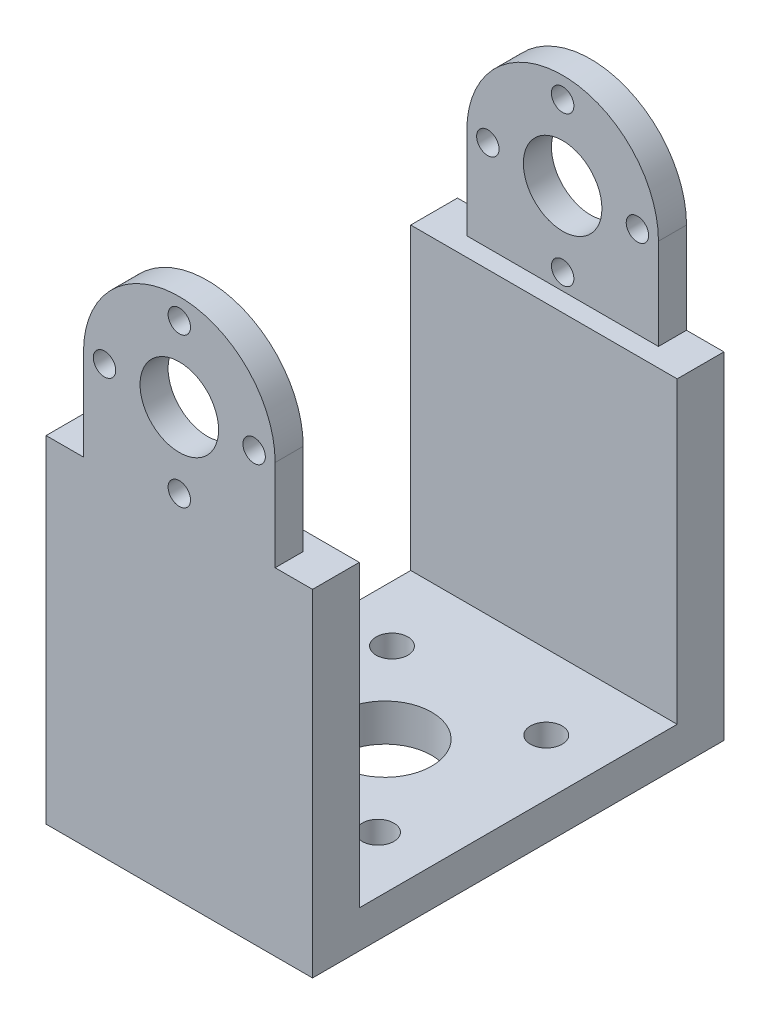
ISO-10303-21;
HEADER;
FILE_DESCRIPTION(('STEP AP214'),'2;1');
FILE_NAME('part.step','',(''),(''),'','','');
FILE_SCHEMA(('AUTOMOTIVE_DESIGN { 1 0 10303 214 1 1 1 1 }'));
ENDSEC;
DATA;
#1=APPLICATION_CONTEXT('core data for automotive mechanical design processes');
#2=APPLICATION_PROTOCOL_DEFINITION('international standard','automotive_design',2000,#1);
#3=PRODUCT_CONTEXT('',#1,'mechanical');
#4=PRODUCT('Part','Part','',(#3));
#5=PRODUCT_RELATED_PRODUCT_CATEGORY('part','',(#4));
#6=PRODUCT_DEFINITION_FORMATION('','',#4);
#7=PRODUCT_DEFINITION_CONTEXT('part definition',#1,'design');
#8=PRODUCT_DEFINITION('design','',#6,#7);
#9=PRODUCT_DEFINITION_SHAPE('','',#8);
#10=(LENGTH_UNIT() NAMED_UNIT(*) SI_UNIT(.MILLI.,.METRE.));
#11=(NAMED_UNIT(*) PLANE_ANGLE_UNIT() SI_UNIT($,.RADIAN.));
#12=(NAMED_UNIT(*) SI_UNIT($,.STERADIAN.) SOLID_ANGLE_UNIT());
#13=UNCERTAINTY_MEASURE_WITH_UNIT(LENGTH_MEASURE(1.E-05),#10,'distance_accuracy_value','');
#14=(GEOMETRIC_REPRESENTATION_CONTEXT(3) GLOBAL_UNCERTAINTY_ASSIGNED_CONTEXT((#13)) GLOBAL_UNIT_ASSIGNED_CONTEXT((#10,
#11,#12)) REPRESENTATION_CONTEXT('',''));
#15=CARTESIAN_POINT('',(0.,0.,0.));
#16=DIRECTION('',(0.,0.,1.));
#17=DIRECTION('',(1.,0.,0.));
#18=AXIS2_PLACEMENT_3D('',#15,#16,#17);
#19=CARTESIAN_POINT('',(17.25,-9.75,-17.));
#20=DIRECTION('',(0.,0.,-1.));
#21=DIRECTION('',(-1.,0.,0.));
#22=AXIS2_PLACEMENT_3D('',#19,#20,#21);
#23=PLANE('',#22);
#24=DIRECTION('',(1.,0.,0.));
#25=VECTOR('',#24,1.);
#26=CARTESIAN_POINT('',(0.,-41.75,-17.));
#27=LINE('',#26,#25);
#28=CARTESIAN_POINT('',(-14.25,-41.75,-17.));
#29=VERTEX_POINT('',#28);
#30=CARTESIAN_POINT('',(14.25,-41.75,-17.));
#31=VERTEX_POINT('',#30);
#32=EDGE_CURVE('E273',#29,#31,#27,.T.);
#33=ORIENTED_EDGE('',*,*,#32,.T.);
#34=DIRECTION('',(0.,1.,0.));
#35=VECTOR('',#34,1.);
#36=CARTESIAN_POINT('',(14.25,-9.75,-17.));
#37=LINE('',#36,#35);
#38=CARTESIAN_POINT('',(14.25,-9.75,-17.));
#39=VERTEX_POINT('',#38);
#40=EDGE_CURVE('E389',#31,#39,#37,.T.);
#41=ORIENTED_EDGE('',*,*,#40,.T.);
#42=DIRECTION('',(-1.,0.,0.));
#43=VECTOR('',#42,1.);
#44=CARTESIAN_POINT('',(17.25,-9.75,-17.));
#45=LINE('',#44,#43);
#46=CARTESIAN_POINT('',(-14.25,-9.75,-17.));
#47=VERTEX_POINT('',#46);
#48=EDGE_CURVE('E11',#39,#47,#45,.T.);
#49=ORIENTED_EDGE('',*,*,#48,.T.);
#50=DIRECTION('',(0.,-1.,0.));
#51=VECTOR('',#50,1.);
#52=CARTESIAN_POINT('',(-14.25,-9.74999999999999,-17.));
#53=LINE('',#52,#51);
#54=EDGE_CURVE('E385',#47,#29,#53,.T.);
#55=ORIENTED_EDGE('',*,*,#54,.T.);
#56=EDGE_LOOP('',(#33,#41,#49,#55));
#57=FACE_BOUND('',#56,.T.);
#58=ADVANCED_FACE('F47',(#57),#23,.F.);
#59=CARTESIAN_POINT('',(10.25,-9.75,-19.));
#60=DIRECTION('',(0.,-1.,0.));
#61=DIRECTION('',(0.,0.,-1.));
#62=AXIS2_PLACEMENT_3D('',#59,#60,#61);
#63=PLANE('',#62);
#64=ORIENTED_EDGE('',*,*,#48,.F.);
#65=DIRECTION('',(0.,0.,-1.));
#66=VECTOR('',#65,1.);
#67=CARTESIAN_POINT('',(14.25,-9.75,22.));
#68=LINE('',#67,#66);
#69=CARTESIAN_POINT('',(14.25,-9.75,-22.));
#70=VERTEX_POINT('',#69);
#71=EDGE_CURVE('E179',#39,#70,#68,.T.);
#72=ORIENTED_EDGE('',*,*,#71,.T.);
#73=DIRECTION('',(-1.,0.,0.));
#74=VECTOR('',#73,1.);
#75=CARTESIAN_POINT('',(10.25,-9.75,-22.));
#76=LINE('',#75,#74);
#77=CARTESIAN_POINT('',(10.25,-9.75,-22.));
#78=VERTEX_POINT('',#77);
#79=EDGE_CURVE('E276',#70,#78,#76,.T.);
#80=ORIENTED_EDGE('',*,*,#79,.T.);
#81=DIRECTION('',(0.,0.,1.));
#82=VECTOR('',#81,1.);
#83=CARTESIAN_POINT('',(10.25,-9.75,-22.));
#84=LINE('',#83,#82);
#85=CARTESIAN_POINT('',(10.25,-9.75,-19.));
#86=VERTEX_POINT('',#85);
#87=EDGE_CURVE('E51',#78,#86,#84,.T.);
#88=ORIENTED_EDGE('',*,*,#87,.T.);
#89=DIRECTION('',(-1.,0.,0.));
#90=VECTOR('',#89,1.);
#91=CARTESIAN_POINT('',(10.25,-9.75,-19.));
#92=LINE('',#91,#90);
#93=CARTESIAN_POINT('',(-10.25,-9.75,-19.));
#94=VERTEX_POINT('',#93);
#95=EDGE_CURVE('E336',#86,#94,#92,.T.);
#96=ORIENTED_EDGE('',*,*,#95,.T.);
#97=DIRECTION('',(0.,0.,-1.));
#98=VECTOR('',#97,1.);
#99=CARTESIAN_POINT('',(-10.25,-9.75,-22.));
#100=LINE('',#99,#98);
#101=CARTESIAN_POINT('',(-10.25,-9.75,-22.));
#102=VERTEX_POINT('',#101);
#103=EDGE_CURVE('E339',#94,#102,#100,.T.);
#104=ORIENTED_EDGE('',*,*,#103,.T.);
#105=DIRECTION('',(-1.,0.,0.));
#106=VECTOR('',#105,1.);
#107=CARTESIAN_POINT('',(-10.25,-9.75,-22.));
#108=LINE('',#107,#106);
#109=CARTESIAN_POINT('',(-14.25,-9.75,-22.));
#110=VERTEX_POINT('',#109);
#111=EDGE_CURVE('E307',#102,#110,#108,.T.);
#112=ORIENTED_EDGE('',*,*,#111,.T.);
#113=DIRECTION('',(0.,0.,-1.));
#114=VECTOR('',#113,1.);
#115=CARTESIAN_POINT('',(-14.25,-9.75,22.));
#116=LINE('',#115,#114);
#117=EDGE_CURVE('E64',#47,#110,#116,.T.);
#118=ORIENTED_EDGE('',*,*,#117,.F.);
#119=EDGE_LOOP('',(#64,#72,#80,#88,#96,#104,#112,#118));
#120=FACE_BOUND('',#119,.T.);
#121=ADVANCED_FACE('F354',(#120),#63,.F.);
#122=CARTESIAN_POINT('',(0.,-45.75,0.));
#123=DIRECTION('',(0.,-1.,0.));
#124=DIRECTION('',(0.,0.,-1.));
#125=AXIS2_PLACEMENT_3D('',#122,#123,#124);
#126=PLANE('',#125);
#127=DIRECTION('',(0.,0.,-1.));
#128=VECTOR('',#127,1.);
#129=CARTESIAN_POINT('',(14.25,-45.75,0.));
#130=LINE('',#129,#128);
#131=CARTESIAN_POINT('',(14.25,-45.75,22.));
#132=VERTEX_POINT('',#131);
#133=CARTESIAN_POINT('',(14.25,-45.75,-22.));
#134=VERTEX_POINT('',#133);
#135=EDGE_CURVE('E72',#132,#134,#130,.T.);
#136=ORIENTED_EDGE('',*,*,#135,.F.);
#137=DIRECTION('',(1.,0.,0.));
#138=VECTOR('',#137,1.);
#139=CARTESIAN_POINT('',(-10.25,-45.75,22.));
#140=LINE('',#139,#138);
#141=CARTESIAN_POINT('',(-14.25,-45.75,22.));
#142=VERTEX_POINT('',#141);
#143=EDGE_CURVE('E165',#142,#132,#140,.T.);
#144=ORIENTED_EDGE('',*,*,#143,.F.);
#145=DIRECTION('',(0.,0.,-1.));
#146=VECTOR('',#145,1.);
#147=CARTESIAN_POINT('',(-14.25,-45.75,0.));
#148=LINE('',#147,#146);
#149=CARTESIAN_POINT('',(-14.25,-45.75,-22.));
#150=VERTEX_POINT('',#149);
#151=EDGE_CURVE('E168',#142,#150,#148,.T.);
#152=ORIENTED_EDGE('',*,*,#151,.T.);
#153=DIRECTION('',(-1.,0.,0.));
#154=VECTOR('',#153,1.);
#155=CARTESIAN_POINT('',(10.25,-45.75,-22.));
#156=LINE('',#155,#154);
#157=EDGE_CURVE('E167',#134,#150,#156,.T.);
#158=ORIENTED_EDGE('',*,*,#157,.F.);
#159=EDGE_LOOP('',(#136,#144,#152,#158));
#160=FACE_BOUND('',#159,.T.);
#161=CARTESIAN_POINT('',(-8.24999999999981,-45.75,-8.99999999999999));
#162=DIRECTION('',(0.,-1.,0.));
#163=DIRECTION('',(0.,0.,-1.));
#164=AXIS2_PLACEMENT_3D('',#161,#162,#163);
#165=CIRCLE('',#164,1.7);
#166=CARTESIAN_POINT('',(-8.24999999999981,-45.75,-10.7));
#167=VERTEX_POINT('',#166);
#168=EDGE_CURVE('E245',#167,#167,#165,.T.);
#169=ORIENTED_EDGE('',*,*,#168,.F.);
#170=EDGE_LOOP('',(#169));
#171=FACE_BOUND('',#170,.T.);
#172=CARTESIAN_POINT('',(8.2500000000002,-45.75,-8.99999999999999));
#173=DIRECTION('',(0.,-1.,0.));
#174=DIRECTION('',(0.,0.,-1.));
#175=AXIS2_PLACEMENT_3D('',#172,#173,#174);
#176=CIRCLE('',#175,1.7);
#177=CARTESIAN_POINT('',(8.2500000000002,-45.75,-10.7));
#178=VERTEX_POINT('',#177);
#179=EDGE_CURVE('E279',#178,#178,#176,.T.);
#180=ORIENTED_EDGE('',*,*,#179,.F.);
#181=EDGE_LOOP('',(#180));
#182=FACE_BOUND('',#181,.T.);
#183=CARTESIAN_POINT('',(8.25000000000001,-45.75,9.00000000000001));
#184=DIRECTION('',(0.,-1.,0.));
#185=DIRECTION('',(0.,0.,-1.));
#186=AXIS2_PLACEMENT_3D('',#183,#184,#185);
#187=CIRCLE('',#186,1.7);
#188=CARTESIAN_POINT('',(8.25000000000001,-45.75,7.30000000000001));
#189=VERTEX_POINT('',#188);
#190=EDGE_CURVE('E282',#189,#189,#187,.T.);
#191=ORIENTED_EDGE('',*,*,#190,.F.);
#192=EDGE_LOOP('',(#191));
#193=FACE_BOUND('',#192,.T.);
#194=CARTESIAN_POINT('',(-8.24999999999999,-45.75,9.00000000000001));
#195=DIRECTION('',(0.,-1.,0.));
#196=DIRECTION('',(0.,0.,-1.));
#197=AXIS2_PLACEMENT_3D('',#194,#195,#196);
#198=CIRCLE('',#197,1.7);
#199=CARTESIAN_POINT('',(-8.24999999999999,-45.75,7.30000000000001));
#200=VERTEX_POINT('',#199);
#201=EDGE_CURVE('E285',#200,#200,#198,.T.);
#202=ORIENTED_EDGE('',*,*,#201,.F.);
#203=EDGE_LOOP('',(#202));
#204=FACE_BOUND('',#203,.T.);
#205=CARTESIAN_POINT('',(0.,-45.75,0.));
#206=DIRECTION('',(0.,-1.,0.));
#207=DIRECTION('',(0.,0.,-1.));
#208=AXIS2_PLACEMENT_3D('',#205,#206,#207);
#209=CIRCLE('',#208,5.);
#210=CARTESIAN_POINT('',(0.,-45.75,-5.));
#211=VERTEX_POINT('',#210);
#212=EDGE_CURVE('E169',#211,#211,#209,.T.);
#213=ORIENTED_EDGE('',*,*,#212,.F.);
#214=EDGE_LOOP('',(#213));
#215=FACE_BOUND('',#214,.T.);
#216=ADVANCED_FACE('F49',(#160,#171,#182,#193,#204,#215),#126,.T.);
#217=CARTESIAN_POINT('',(-10.25,0.,-22.));
#218=DIRECTION('',(-1.,0.,0.));
#219=DIRECTION('',(0.,0.,1.));
#220=AXIS2_PLACEMENT_3D('',#217,#218,#219);
#221=PLANE('',#220);
#222=DIRECTION('',(0.,-1.,0.));
#223=VECTOR('',#222,1.);
#224=CARTESIAN_POINT('',(-10.25,0.,-22.));
#225=LINE('',#224,#223);
#226=CARTESIAN_POINT('',(-10.25,0.,-22.));
#227=VERTEX_POINT('',#226);
#228=EDGE_CURVE('E303',#227,#102,#225,.T.);
#229=ORIENTED_EDGE('',*,*,#228,.T.);
#230=ORIENTED_EDGE('',*,*,#103,.F.);
#231=DIRECTION('',(0.,-1.,0.));
#232=VECTOR('',#231,1.);
#233=CARTESIAN_POINT('',(-10.25,10.25,-19.));
#234=LINE('',#233,#232);
#235=CARTESIAN_POINT('',(-10.25,0.,-19.));
#236=VERTEX_POINT('',#235);
#237=EDGE_CURVE('E56',#236,#94,#234,.T.);
#238=ORIENTED_EDGE('',*,*,#237,.F.);
#239=DIRECTION('',(0.,0.,1.));
#240=VECTOR('',#239,1.);
#241=CARTESIAN_POINT('',(-10.25,0.,-22.));
#242=LINE('',#241,#240);
#243=EDGE_CURVE('E310',#227,#236,#242,.T.);
#244=ORIENTED_EDGE('',*,*,#243,.F.);
#245=EDGE_LOOP('',(#229,#230,#238,#244));
#246=FACE_BOUND('',#245,.T.);
#247=ADVANCED_FACE('F365',(#246),#221,.T.);
#248=CARTESIAN_POINT('',(0.,0.,-22.));
#249=DIRECTION('',(0.,0.,1.));
#250=DIRECTION('',(1.,0.,0.));
#251=AXIS2_PLACEMENT_3D('',#248,#249,#250);
#252=CYLINDRICAL_SURFACE('',#251,10.25);
#253=CARTESIAN_POINT('',(0.,0.,-19.));
#254=DIRECTION('',(0.,0.,-1.));
#255=DIRECTION('',(-1.,0.,0.));
#256=AXIS2_PLACEMENT_3D('',#253,#254,#255);
#257=CIRCLE('',#256,10.25);
#258=CARTESIAN_POINT('',(10.25,0.,-19.));
#259=VERTEX_POINT('',#258);
#260=EDGE_CURVE('E299',#259,#236,#257,.F.);
#261=ORIENTED_EDGE('',*,*,#260,.F.);
#262=DIRECTION('',(0.,0.,1.));
#263=VECTOR('',#262,1.);
#264=CARTESIAN_POINT('',(10.25,0.,-22.));
#265=LINE('',#264,#263);
#266=CARTESIAN_POINT('',(10.25,0.,-22.));
#267=VERTEX_POINT('',#266);
#268=EDGE_CURVE('E323',#267,#259,#265,.T.);
#269=ORIENTED_EDGE('',*,*,#268,.F.);
#270=CARTESIAN_POINT('',(0.,0.,-22.));
#271=DIRECTION('',(0.,0.,1.));
#272=DIRECTION('',(1.,0.,0.));
#273=AXIS2_PLACEMENT_3D('',#270,#271,#272);
#274=CIRCLE('',#273,10.25);
#275=EDGE_CURVE('E306',#267,#227,#274,.T.);
#276=ORIENTED_EDGE('',*,*,#275,.T.);
#277=ORIENTED_EDGE('',*,*,#243,.T.);
#278=EDGE_LOOP('',(#261,#269,#276,#277));
#279=FACE_BOUND('',#278,.T.);
#280=ADVANCED_FACE('F368',(#279),#252,.T.);
#281=CARTESIAN_POINT('',(0.,0.,-22.));
#282=DIRECTION('',(0.,0.,1.));
#283=DIRECTION('',(1.,0.,0.));
#284=AXIS2_PLACEMENT_3D('',#281,#282,#283);
#285=CYLINDRICAL_SURFACE('',#284,4.2);
#286=CARTESIAN_POINT('',(0.,0.,-19.));
#287=DIRECTION('',(0.,0.,-1.));
#288=DIRECTION('',(-1.,0.,0.));
#289=AXIS2_PLACEMENT_3D('',#286,#287,#288);
#290=CIRCLE('',#289,4.2);
#291=CARTESIAN_POINT('',(-4.2,0.,-19.));
#292=VERTEX_POINT('',#291);
#293=EDGE_CURVE('E325',#292,#292,#290,.F.);
#294=ORIENTED_EDGE('',*,*,#293,.T.);
#295=EDGE_LOOP('',(#294));
#296=FACE_BOUND('',#295,.T.);
#297=CARTESIAN_POINT('',(0.,0.,-22.));
#298=DIRECTION('',(0.,0.,1.));
#299=DIRECTION('',(1.,0.,0.));
#300=AXIS2_PLACEMENT_3D('',#297,#298,#299);
#301=CIRCLE('',#300,4.2);
#302=CARTESIAN_POINT('',(4.2,0.,-22.));
#303=VERTEX_POINT('',#302);
#304=EDGE_CURVE('E311',#303,#303,#301,.T.);
#305=ORIENTED_EDGE('',*,*,#304,.F.);
#306=EDGE_LOOP('',(#305));
#307=FACE_BOUND('',#306,.T.);
#308=ADVANCED_FACE('F440',(#296,#307),#285,.F.);
#309=CARTESIAN_POINT('',(8.,0.,-22.));
#310=DIRECTION('',(0.,0.,1.));
#311=DIRECTION('',(1.,0.,0.));
#312=AXIS2_PLACEMENT_3D('',#309,#310,#311);
#313=CYLINDRICAL_SURFACE('',#312,1.2);
#314=CARTESIAN_POINT('',(8.,0.,-19.));
#315=DIRECTION('',(0.,0.,-1.));
#316=DIRECTION('',(-1.,0.,0.));
#317=AXIS2_PLACEMENT_3D('',#314,#315,#316);
#318=CIRCLE('',#317,1.2);
#319=CARTESIAN_POINT('',(6.8,0.,-19.));
#320=VERTEX_POINT('',#319);
#321=EDGE_CURVE('E328',#320,#320,#318,.F.);
#322=ORIENTED_EDGE('',*,*,#321,.T.);
#323=EDGE_LOOP('',(#322));
#324=FACE_BOUND('',#323,.T.);
#325=CARTESIAN_POINT('',(8.,0.,-22.));
#326=DIRECTION('',(0.,0.,1.));
#327=DIRECTION('',(1.,0.,0.));
#328=AXIS2_PLACEMENT_3D('',#325,#326,#327);
#329=CIRCLE('',#328,1.2);
#330=CARTESIAN_POINT('',(9.2,0.,-22.));
#331=VERTEX_POINT('',#330);
#332=EDGE_CURVE('E314',#331,#331,#329,.T.);
#333=ORIENTED_EDGE('',*,*,#332,.F.);
#334=EDGE_LOOP('',(#333));
#335=FACE_BOUND('',#334,.T.);
#336=ADVANCED_FACE('F443',(#324,#335),#313,.F.);
#337=CARTESIAN_POINT('',(0.,8.,-22.));
#338=DIRECTION('',(0.,0.,1.));
#339=DIRECTION('',(1.,0.,0.));
#340=AXIS2_PLACEMENT_3D('',#337,#338,#339);
#341=CYLINDRICAL_SURFACE('',#340,1.2);
#342=CARTESIAN_POINT('',(0.,8.,-19.));
#343=DIRECTION('',(0.,0.,-1.));
#344=DIRECTION('',(-1.,0.,0.));
#345=AXIS2_PLACEMENT_3D('',#342,#343,#344);
#346=CIRCLE('',#345,1.2);
#347=CARTESIAN_POINT('',(-1.2,8.,-19.));
#348=VERTEX_POINT('',#347);
#349=EDGE_CURVE('E331',#348,#348,#346,.F.);
#350=ORIENTED_EDGE('',*,*,#349,.T.);
#351=EDGE_LOOP('',(#350));
#352=FACE_BOUND('',#351,.T.);
#353=CARTESIAN_POINT('',(0.,8.,-22.));
#354=DIRECTION('',(0.,0.,1.));
#355=DIRECTION('',(1.,0.,0.));
#356=AXIS2_PLACEMENT_3D('',#353,#354,#355);
#357=CIRCLE('',#356,1.2);
#358=CARTESIAN_POINT('',(1.2,8.,-22.));
#359=VERTEX_POINT('',#358);
#360=EDGE_CURVE('E317',#359,#359,#357,.T.);
#361=ORIENTED_EDGE('',*,*,#360,.F.);
#362=EDGE_LOOP('',(#361));
#363=FACE_BOUND('',#362,.T.);
#364=ADVANCED_FACE('F447',(#352,#363),#341,.F.);
#365=CARTESIAN_POINT('',(-8.,0.,-22.));
#366=DIRECTION('',(0.,0.,1.));
#367=DIRECTION('',(1.,0.,0.));
#368=AXIS2_PLACEMENT_3D('',#365,#366,#367);
#369=CYLINDRICAL_SURFACE('',#368,1.2);
#370=CARTESIAN_POINT('',(-8.,0.,-19.));
#371=DIRECTION('',(0.,0.,-1.));
#372=DIRECTION('',(-1.,0.,0.));
#373=AXIS2_PLACEMENT_3D('',#370,#371,#372);
#374=CIRCLE('',#373,1.2);
#375=CARTESIAN_POINT('',(-9.2,0.,-19.));
#376=VERTEX_POINT('',#375);
#377=EDGE_CURVE('E295',#376,#376,#374,.F.);
#378=ORIENTED_EDGE('',*,*,#377,.T.);
#379=EDGE_LOOP('',(#378));
#380=FACE_BOUND('',#379,.T.);
#381=CARTESIAN_POINT('',(-8.,0.,-22.));
#382=DIRECTION('',(0.,0.,1.));
#383=DIRECTION('',(1.,0.,0.));
#384=AXIS2_PLACEMENT_3D('',#381,#382,#383);
#385=CIRCLE('',#384,1.2);
#386=CARTESIAN_POINT('',(-6.8,0.,-22.));
#387=VERTEX_POINT('',#386);
#388=EDGE_CURVE('E320',#387,#387,#385,.T.);
#389=ORIENTED_EDGE('',*,*,#388,.F.);
#390=EDGE_LOOP('',(#389));
#391=FACE_BOUND('',#390,.T.);
#392=ADVANCED_FACE('F438',(#380,#391),#369,.F.);
#393=CARTESIAN_POINT('',(0.,-8.,-22.));
#394=DIRECTION('',(0.,0.,1.));
#395=DIRECTION('',(1.,0.,0.));
#396=AXIS2_PLACEMENT_3D('',#393,#394,#395);
#397=CYLINDRICAL_SURFACE('',#396,1.2);
#398=CARTESIAN_POINT('',(0.,-8.,-19.));
#399=DIRECTION('',(0.,0.,-1.));
#400=DIRECTION('',(-1.,0.,0.));
#401=AXIS2_PLACEMENT_3D('',#398,#399,#400);
#402=CIRCLE('',#401,1.2);
#403=CARTESIAN_POINT('',(-1.20000000000006,-8.,-19.));
#404=VERTEX_POINT('',#403);
#405=EDGE_CURVE('E291',#404,#404,#402,.F.);
#406=ORIENTED_EDGE('',*,*,#405,.T.);
#407=EDGE_LOOP('',(#406));
#408=FACE_BOUND('',#407,.T.);
#409=CARTESIAN_POINT('',(0.,-8.,-22.));
#410=DIRECTION('',(0.,0.,1.));
#411=DIRECTION('',(1.,0.,0.));
#412=AXIS2_PLACEMENT_3D('',#409,#410,#411);
#413=CIRCLE('',#412,1.2);
#414=CARTESIAN_POINT('',(1.19999999999994,-8.,-22.));
#415=VERTEX_POINT('',#414);
#416=EDGE_CURVE('E296',#415,#415,#413,.T.);
#417=ORIENTED_EDGE('',*,*,#416,.F.);
#418=EDGE_LOOP('',(#417));
#419=FACE_BOUND('',#418,.T.);
#420=ADVANCED_FACE('F435',(#408,#419),#397,.F.);
#421=CARTESIAN_POINT('',(10.25,0.,-22.));
#422=DIRECTION('',(-1.,0.,0.));
#423=DIRECTION('',(0.,0.,1.));
#424=AXIS2_PLACEMENT_3D('',#421,#422,#423);
#425=PLANE('',#424);
#426=DIRECTION('',(0.,-1.,0.));
#427=VECTOR('',#426,1.);
#428=CARTESIAN_POINT('',(10.25,10.25,-19.));
#429=LINE('',#428,#427);
#430=EDGE_CURVE('E294',#259,#86,#429,.T.);
#431=ORIENTED_EDGE('',*,*,#430,.T.);
#432=ORIENTED_EDGE('',*,*,#87,.F.);
#433=DIRECTION('',(0.,-1.,0.));
#434=VECTOR('',#433,1.);
#435=CARTESIAN_POINT('',(10.25,0.,-22.));
#436=LINE('',#435,#434);
#437=EDGE_CURVE('E300',#267,#78,#436,.T.);
#438=ORIENTED_EDGE('',*,*,#437,.F.);
#439=ORIENTED_EDGE('',*,*,#268,.T.);
#440=EDGE_LOOP('',(#431,#432,#438,#439));
#441=FACE_BOUND('',#440,.T.);
#442=ADVANCED_FACE('F372',(#441),#425,.F.);
#443=CARTESIAN_POINT('',(0.,0.,-22.));
#444=DIRECTION('',(0.,0.,1.));
#445=DIRECTION('',(1.,0.,0.));
#446=AXIS2_PLACEMENT_3D('',#443,#444,#445);
#447=PLANE('',#446);
#448=ORIENTED_EDGE('',*,*,#388,.T.);
#449=EDGE_LOOP('',(#448));
#450=FACE_BOUND('',#449,.T.);
#451=ORIENTED_EDGE('',*,*,#360,.T.);
#452=EDGE_LOOP('',(#451));
#453=FACE_BOUND('',#452,.T.);
#454=ORIENTED_EDGE('',*,*,#332,.T.);
#455=EDGE_LOOP('',(#454));
#456=FACE_BOUND('',#455,.T.);
#457=ORIENTED_EDGE('',*,*,#304,.T.);
#458=EDGE_LOOP('',(#457));
#459=FACE_BOUND('',#458,.T.);
#460=ORIENTED_EDGE('',*,*,#79,.F.);
#461=DIRECTION('',(0.,1.,0.));
#462=VECTOR('',#461,1.);
#463=CARTESIAN_POINT('',(14.25,-9.75,-22.));
#464=LINE('',#463,#462);
#465=EDGE_CURVE('E180',#134,#70,#464,.T.);
#466=ORIENTED_EDGE('',*,*,#465,.F.);
#467=ORIENTED_EDGE('',*,*,#157,.T.);
#468=DIRECTION('',(0.,-1.,0.));
#469=VECTOR('',#468,1.);
#470=CARTESIAN_POINT('',(-14.25,-9.75,-22.));
#471=LINE('',#470,#469);
#472=EDGE_CURVE('E364',#110,#150,#471,.T.);
#473=ORIENTED_EDGE('',*,*,#472,.F.);
#474=ORIENTED_EDGE('',*,*,#111,.F.);
#475=ORIENTED_EDGE('',*,*,#228,.F.);
#476=ORIENTED_EDGE('',*,*,#275,.F.);
#477=ORIENTED_EDGE('',*,*,#437,.T.);
#478=EDGE_LOOP('',(#460,#466,#467,#473,#474,#475,#476,#477));
#479=FACE_BOUND('',#478,.T.);
#480=ORIENTED_EDGE('',*,*,#416,.T.);
#481=EDGE_LOOP('',(#480));
#482=FACE_BOUND('',#481,.T.);
#483=ADVANCED_FACE('F361',(#450,#453,#456,#459,#479,#482),#447,.F.);
#484=CARTESIAN_POINT('',(10.25,10.25,-19.));
#485=DIRECTION('',(0.,0.,-1.));
#486=DIRECTION('',(-1.,0.,0.));
#487=AXIS2_PLACEMENT_3D('',#484,#485,#486);
#488=PLANE('',#487);
#489=ORIENTED_EDGE('',*,*,#260,.T.);
#490=ORIENTED_EDGE('',*,*,#237,.T.);
#491=ORIENTED_EDGE('',*,*,#95,.F.);
#492=ORIENTED_EDGE('',*,*,#430,.F.);
#493=EDGE_LOOP('',(#489,#490,#491,#492));
#494=FACE_BOUND('',#493,.T.);
#495=ORIENTED_EDGE('',*,*,#321,.F.);
#496=EDGE_LOOP('',(#495));
#497=FACE_BOUND('',#496,.T.);
#498=ORIENTED_EDGE('',*,*,#377,.F.);
#499=EDGE_LOOP('',(#498));
#500=FACE_BOUND('',#499,.T.);
#501=ORIENTED_EDGE('',*,*,#405,.F.);
#502=EDGE_LOOP('',(#501));
#503=FACE_BOUND('',#502,.T.);
#504=ORIENTED_EDGE('',*,*,#349,.F.);
#505=EDGE_LOOP('',(#504));
#506=FACE_BOUND('',#505,.T.);
#507=ORIENTED_EDGE('',*,*,#293,.F.);
#508=EDGE_LOOP('',(#507));
#509=FACE_BOUND('',#508,.T.);
#510=ADVANCED_FACE('F433',(#494,#497,#500,#503,#506,#509),#488,.F.);
#511=CARTESIAN_POINT('',(14.25,-41.75,0.));
#512=DIRECTION('',(-1.,0.,0.));
#513=DIRECTION('',(0.,0.,1.));
#514=AXIS2_PLACEMENT_3D('',#511,#512,#513);
#515=PLANE('',#514);
#516=ORIENTED_EDGE('',*,*,#135,.T.);
#517=ORIENTED_EDGE('',*,*,#465,.T.);
#518=ORIENTED_EDGE('',*,*,#71,.F.);
#519=ORIENTED_EDGE('',*,*,#40,.F.);
#520=DIRECTION('',(0.,0.,-1.));
#521=VECTOR('',#520,1.);
#522=CARTESIAN_POINT('',(14.25,-41.75,0.));
#523=LINE('',#522,#521);
#524=CARTESIAN_POINT('',(14.25,-41.75,17.));
#525=VERTEX_POINT('',#524);
#526=EDGE_CURVE('E264',#525,#31,#523,.T.);
#527=ORIENTED_EDGE('',*,*,#526,.F.);
#528=DIRECTION('',(0.,-1.,0.));
#529=VECTOR('',#528,1.);
#530=CARTESIAN_POINT('',(14.25,-9.75,17.));
#531=LINE('',#530,#529);
#532=CARTESIAN_POINT('',(14.25,-9.75,17.));
#533=VERTEX_POINT('',#532);
#534=EDGE_CURVE('E387',#533,#525,#531,.T.);
#535=ORIENTED_EDGE('',*,*,#534,.F.);
#536=CARTESIAN_POINT('',(14.25,-9.75,22.));
#537=VERTEX_POINT('',#536);
#538=EDGE_CURVE('E175',#537,#533,#68,.T.);
#539=ORIENTED_EDGE('',*,*,#538,.F.);
#540=DIRECTION('',(0.,1.,0.));
#541=VECTOR('',#540,1.);
#542=CARTESIAN_POINT('',(14.25,-9.75,22.));
#543=LINE('',#542,#541);
#544=EDGE_CURVE('E172',#132,#537,#543,.T.);
#545=ORIENTED_EDGE('',*,*,#544,.F.);
#546=EDGE_LOOP('',(#516,#517,#518,#519,#527,#535,#539,#545));
#547=FACE_BOUND('',#546,.T.);
#548=ADVANCED_FACE('F173',(#547),#515,.F.);
#549=CARTESIAN_POINT('',(-14.25,-41.75,0.));
#550=DIRECTION('',(-1.,0.,0.));
#551=DIRECTION('',(0.,0.,1.));
#552=AXIS2_PLACEMENT_3D('',#549,#550,#551);
#553=PLANE('',#552);
#554=ORIENTED_EDGE('',*,*,#151,.F.);
#555=DIRECTION('',(0.,-1.,0.));
#556=VECTOR('',#555,1.);
#557=CARTESIAN_POINT('',(-14.25,-9.75,22.));
#558=LINE('',#557,#556);
#559=CARTESIAN_POINT('',(-14.25,-9.75,22.));
#560=VERTEX_POINT('',#559);
#561=EDGE_CURVE('E186',#560,#142,#558,.T.);
#562=ORIENTED_EDGE('',*,*,#561,.F.);
#563=CARTESIAN_POINT('',(-14.25,-9.75,17.));
#564=VERTEX_POINT('',#563);
#565=EDGE_CURVE('E379',#560,#564,#116,.T.);
#566=ORIENTED_EDGE('',*,*,#565,.T.);
#567=DIRECTION('',(0.,1.,0.));
#568=VECTOR('',#567,1.);
#569=CARTESIAN_POINT('',(-14.25,-9.74999999999999,17.));
#570=LINE('',#569,#568);
#571=CARTESIAN_POINT('',(-14.25,-41.75,17.));
#572=VERTEX_POINT('',#571);
#573=EDGE_CURVE('E376',#572,#564,#570,.T.);
#574=ORIENTED_EDGE('',*,*,#573,.F.);
#575=DIRECTION('',(0.,0.,-1.));
#576=VECTOR('',#575,1.);
#577=CARTESIAN_POINT('',(-14.25,-41.75,0.));
#578=LINE('',#577,#576);
#579=EDGE_CURVE('E270',#572,#29,#578,.T.);
#580=ORIENTED_EDGE('',*,*,#579,.T.);
#581=ORIENTED_EDGE('',*,*,#54,.F.);
#582=ORIENTED_EDGE('',*,*,#117,.T.);
#583=ORIENTED_EDGE('',*,*,#472,.T.);
#584=EDGE_LOOP('',(#554,#562,#566,#574,#580,#581,#582,#583));
#585=FACE_BOUND('',#584,.T.);
#586=ADVANCED_FACE('F415',(#585),#553,.T.);
#587=CARTESIAN_POINT('',(0.,-41.75,0.));
#588=DIRECTION('',(0.,-1.,0.));
#589=DIRECTION('',(0.,0.,-1.));
#590=AXIS2_PLACEMENT_3D('',#587,#588,#589);
#591=CYLINDRICAL_SURFACE('',#590,5.);
#592=CARTESIAN_POINT('',(0.,-41.75,0.));
#593=DIRECTION('',(0.,-1.,0.));
#594=DIRECTION('',(0.,0.,-1.));
#595=AXIS2_PLACEMENT_3D('',#592,#593,#594);
#596=CIRCLE('',#595,5.);
#597=CARTESIAN_POINT('',(0.,-41.75,-5.));
#598=VERTEX_POINT('',#597);
#599=EDGE_CURVE('E261',#598,#598,#596,.T.);
#600=ORIENTED_EDGE('',*,*,#599,.F.);
#601=EDGE_LOOP('',(#600));
#602=FACE_BOUND('',#601,.T.);
#603=ORIENTED_EDGE('',*,*,#212,.T.);
#604=EDGE_LOOP('',(#603));
#605=FACE_BOUND('',#604,.T.);
#606=ADVANCED_FACE('F487',(#602,#605),#591,.F.);
#607=CARTESIAN_POINT('',(-8.24999999999999,-41.75,9.00000000000001));
#608=DIRECTION('',(0.,-1.,0.));
#609=DIRECTION('',(0.,0.,-1.));
#610=AXIS2_PLACEMENT_3D('',#607,#608,#609);
#611=CYLINDRICAL_SURFACE('',#610,1.7);
#612=CARTESIAN_POINT('',(-8.24999999999999,-41.75,9.00000000000001));
#613=DIRECTION('',(0.,-1.,0.));
#614=DIRECTION('',(0.,0.,-1.));
#615=AXIS2_PLACEMENT_3D('',#612,#613,#614);
#616=CIRCLE('',#615,1.7);
#617=CARTESIAN_POINT('',(-8.24999999999999,-41.75,7.30000000000001));
#618=VERTEX_POINT('',#617);
#619=EDGE_CURVE('E258',#618,#618,#616,.T.);
#620=ORIENTED_EDGE('',*,*,#619,.F.);
#621=EDGE_LOOP('',(#620));
#622=FACE_BOUND('',#621,.T.);
#623=ORIENTED_EDGE('',*,*,#201,.T.);
#624=EDGE_LOOP('',(#623));
#625=FACE_BOUND('',#624,.T.);
#626=ADVANCED_FACE('F483',(#622,#625),#611,.F.);
#627=CARTESIAN_POINT('',(8.25000000000001,-41.75,9.00000000000001));
#628=DIRECTION('',(0.,-1.,0.));
#629=DIRECTION('',(0.,0.,-1.));
#630=AXIS2_PLACEMENT_3D('',#627,#628,#629);
#631=CYLINDRICAL_SURFACE('',#630,1.7);
#632=CARTESIAN_POINT('',(8.25000000000001,-41.75,9.00000000000001));
#633=DIRECTION('',(0.,-1.,0.));
#634=DIRECTION('',(0.,0.,-1.));
#635=AXIS2_PLACEMENT_3D('',#632,#633,#634);
#636=CIRCLE('',#635,1.7);
#637=CARTESIAN_POINT('',(8.25000000000001,-41.75,7.30000000000001));
#638=VERTEX_POINT('',#637);
#639=EDGE_CURVE('E255',#638,#638,#636,.T.);
#640=ORIENTED_EDGE('',*,*,#639,.F.);
#641=EDGE_LOOP('',(#640));
#642=FACE_BOUND('',#641,.T.);
#643=ORIENTED_EDGE('',*,*,#190,.T.);
#644=EDGE_LOOP('',(#643));
#645=FACE_BOUND('',#644,.T.);
#646=ADVANCED_FACE('F479',(#642,#645),#631,.F.);
#647=CARTESIAN_POINT('',(8.2500000000002,-41.75,-8.99999999999999));
#648=DIRECTION('',(0.,-1.,0.));
#649=DIRECTION('',(0.,0.,-1.));
#650=AXIS2_PLACEMENT_3D('',#647,#648,#649);
#651=CYLINDRICAL_SURFACE('',#650,1.7);
#652=CARTESIAN_POINT('',(8.2500000000002,-41.75,-8.99999999999999));
#653=DIRECTION('',(0.,-1.,0.));
#654=DIRECTION('',(0.,0.,-1.));
#655=AXIS2_PLACEMENT_3D('',#652,#653,#654);
#656=CIRCLE('',#655,1.7);
#657=CARTESIAN_POINT('',(8.2500000000002,-41.75,-10.7));
#658=VERTEX_POINT('',#657);
#659=EDGE_CURVE('E252',#658,#658,#656,.T.);
#660=ORIENTED_EDGE('',*,*,#659,.F.);
#661=EDGE_LOOP('',(#660));
#662=FACE_BOUND('',#661,.T.);
#663=ORIENTED_EDGE('',*,*,#179,.T.);
#664=EDGE_LOOP('',(#663));
#665=FACE_BOUND('',#664,.T.);
#666=ADVANCED_FACE('F475',(#662,#665),#651,.F.);
#667=CARTESIAN_POINT('',(-8.24999999999981,-41.75,-8.99999999999999));
#668=DIRECTION('',(0.,-1.,0.));
#669=DIRECTION('',(0.,0.,-1.));
#670=AXIS2_PLACEMENT_3D('',#667,#668,#669);
#671=CYLINDRICAL_SURFACE('',#670,1.7);
#672=CARTESIAN_POINT('',(-8.24999999999981,-41.75,-8.99999999999999));
#673=DIRECTION('',(0.,-1.,0.));
#674=DIRECTION('',(0.,0.,-1.));
#675=AXIS2_PLACEMENT_3D('',#672,#673,#674);
#676=CIRCLE('',#675,1.7);
#677=CARTESIAN_POINT('',(-8.24999999999981,-41.75,-10.7));
#678=VERTEX_POINT('',#677);
#679=EDGE_CURVE('E249',#678,#678,#676,.T.);
#680=ORIENTED_EDGE('',*,*,#679,.F.);
#681=EDGE_LOOP('',(#680));
#682=FACE_BOUND('',#681,.T.);
#683=ORIENTED_EDGE('',*,*,#168,.T.);
#684=EDGE_LOOP('',(#683));
#685=FACE_BOUND('',#684,.T.);
#686=ADVANCED_FACE('F472',(#682,#685),#671,.F.);
#687=CARTESIAN_POINT('',(0.,-41.75,0.));
#688=DIRECTION('',(0.,-1.,0.));
#689=DIRECTION('',(0.,0.,-1.));
#690=AXIS2_PLACEMENT_3D('',#687,#688,#689);
#691=PLANE('',#690);
#692=ORIENTED_EDGE('',*,*,#679,.T.);
#693=EDGE_LOOP('',(#692));
#694=FACE_BOUND('',#693,.T.);
#695=ORIENTED_EDGE('',*,*,#659,.T.);
#696=EDGE_LOOP('',(#695));
#697=FACE_BOUND('',#696,.T.);
#698=ORIENTED_EDGE('',*,*,#639,.T.);
#699=EDGE_LOOP('',(#698));
#700=FACE_BOUND('',#699,.T.);
#701=ORIENTED_EDGE('',*,*,#619,.T.);
#702=EDGE_LOOP('',(#701));
#703=FACE_BOUND('',#702,.T.);
#704=ORIENTED_EDGE('',*,*,#599,.T.);
#705=EDGE_LOOP('',(#704));
#706=FACE_BOUND('',#705,.T.);
#707=ORIENTED_EDGE('',*,*,#526,.T.);
#708=ORIENTED_EDGE('',*,*,#32,.F.);
#709=ORIENTED_EDGE('',*,*,#579,.F.);
#710=DIRECTION('',(1.,0.,0.));
#711=VECTOR('',#710,1.);
#712=CARTESIAN_POINT('',(0.,-41.75,17.));
#713=LINE('',#712,#711);
#714=EDGE_CURVE('E267',#572,#525,#713,.T.);
#715=ORIENTED_EDGE('',*,*,#714,.T.);
#716=EDGE_LOOP('',(#707,#708,#709,#715));
#717=FACE_BOUND('',#716,.T.);
#718=ADVANCED_FACE('F422',(#694,#697,#700,#703,#706,#717),#691,.F.);
#719=CARTESIAN_POINT('',(10.25,10.25,19.));
#720=DIRECTION('',(0.,0.,1.));
#721=DIRECTION('',(0.,-1.,0.));
#722=AXIS2_PLACEMENT_3D('',#719,#720,#721);
#723=PLANE('',#722);
#724=CARTESIAN_POINT('',(0.,0.,19.));
#725=DIRECTION('',(0.,0.,1.));
#726=DIRECTION('',(0.,-1.,0.));
#727=AXIS2_PLACEMENT_3D('',#724,#725,#726);
#728=CIRCLE('',#727,10.25);
#729=CARTESIAN_POINT('',(-10.25,0.,19.));
#730=VERTEX_POINT('',#729);
#731=CARTESIAN_POINT('',(10.25,0.,19.));
#732=VERTEX_POINT('',#731);
#733=EDGE_CURVE('E217',#730,#732,#728,.F.);
#734=ORIENTED_EDGE('',*,*,#733,.T.);
#735=DIRECTION('',(0.,1.,0.));
#736=VECTOR('',#735,1.);
#737=CARTESIAN_POINT('',(10.25,10.25,19.));
#738=LINE('',#737,#736);
#739=CARTESIAN_POINT('',(10.25,-9.75,19.));
#740=VERTEX_POINT('',#739);
#741=EDGE_CURVE('E190',#740,#732,#738,.T.);
#742=ORIENTED_EDGE('',*,*,#741,.F.);
#743=DIRECTION('',(-1.,0.,0.));
#744=VECTOR('',#743,1.);
#745=CARTESIAN_POINT('',(10.25,-9.75,19.));
#746=LINE('',#745,#744);
#747=CARTESIAN_POINT('',(-10.25,-9.75,19.));
#748=VERTEX_POINT('',#747);
#749=EDGE_CURVE('E200',#740,#748,#746,.T.);
#750=ORIENTED_EDGE('',*,*,#749,.T.);
#751=DIRECTION('',(0.,1.,0.));
#752=VECTOR('',#751,1.);
#753=CARTESIAN_POINT('',(-10.25,10.25,19.));
#754=LINE('',#753,#752);
#755=EDGE_CURVE('E187',#748,#730,#754,.T.);
#756=ORIENTED_EDGE('',*,*,#755,.T.);
#757=EDGE_LOOP('',(#734,#742,#750,#756));
#758=FACE_BOUND('',#757,.T.);
#759=CARTESIAN_POINT('',(8.,0.,19.));
#760=DIRECTION('',(0.,0.,1.));
#761=DIRECTION('',(0.,-1.,0.));
#762=AXIS2_PLACEMENT_3D('',#759,#760,#761);
#763=CIRCLE('',#762,1.2);
#764=CARTESIAN_POINT('',(8.,-1.20000000000003,19.));
#765=VERTEX_POINT('',#764);
#766=EDGE_CURVE('E211',#765,#765,#763,.F.);
#767=ORIENTED_EDGE('',*,*,#766,.F.);
#768=EDGE_LOOP('',(#767));
#769=FACE_BOUND('',#768,.T.);
#770=CARTESIAN_POINT('',(-8.,0.,19.));
#771=DIRECTION('',(0.,0.,1.));
#772=DIRECTION('',(0.,-1.,0.));
#773=AXIS2_PLACEMENT_3D('',#770,#771,#772);
#774=CIRCLE('',#773,1.2);
#775=CARTESIAN_POINT('',(-8.,-1.19999999999992,19.));
#776=VERTEX_POINT('',#775);
#777=EDGE_CURVE('E205',#776,#776,#774,.F.);
#778=ORIENTED_EDGE('',*,*,#777,.F.);
#779=EDGE_LOOP('',(#778));
#780=FACE_BOUND('',#779,.T.);
#781=CARTESIAN_POINT('',(0.,-8.,19.));
#782=DIRECTION('',(0.,0.,1.));
#783=DIRECTION('',(0.,-1.,0.));
#784=AXIS2_PLACEMENT_3D('',#781,#782,#783);
#785=CIRCLE('',#784,1.2);
#786=CARTESIAN_POINT('',(0.,-9.2,19.));
#787=VERTEX_POINT('',#786);
#788=EDGE_CURVE('E204',#787,#787,#785,.F.);
#789=ORIENTED_EDGE('',*,*,#788,.F.);
#790=EDGE_LOOP('',(#789));
#791=FACE_BOUND('',#790,.T.);
#792=CARTESIAN_POINT('',(0.,8.,19.));
#793=DIRECTION('',(0.,0.,1.));
#794=DIRECTION('',(0.,-1.,0.));
#795=AXIS2_PLACEMENT_3D('',#792,#793,#794);
#796=CIRCLE('',#795,1.2);
#797=CARTESIAN_POINT('',(0.,6.8,19.));
#798=VERTEX_POINT('',#797);
#799=EDGE_CURVE('E208',#798,#798,#796,.F.);
#800=ORIENTED_EDGE('',*,*,#799,.F.);
#801=EDGE_LOOP('',(#800));
#802=FACE_BOUND('',#801,.T.);
#803=CARTESIAN_POINT('',(0.,0.,19.));
#804=DIRECTION('',(0.,0.,1.));
#805=DIRECTION('',(0.,-1.,0.));
#806=AXIS2_PLACEMENT_3D('',#803,#804,#805);
#807=CIRCLE('',#806,4.2);
#808=CARTESIAN_POINT('',(0.,-4.2,19.));
#809=VERTEX_POINT('',#808);
#810=EDGE_CURVE('E214',#809,#809,#807,.F.);
#811=ORIENTED_EDGE('',*,*,#810,.F.);
#812=EDGE_LOOP('',(#811));
#813=FACE_BOUND('',#812,.T.);
#814=ADVANCED_FACE('F497',(#758,#769,#780,#791,#802,#813),#723,.F.);
#815=CARTESIAN_POINT('',(0.,-8.,-22.));
#816=DIRECTION('',(0.,0.,1.));
#817=DIRECTION('',(1.,0.,0.));
#818=AXIS2_PLACEMENT_3D('',#815,#816,#817);
#819=CYLINDRICAL_SURFACE('',#818,1.2);
#820=ORIENTED_EDGE('',*,*,#788,.T.);
#821=EDGE_LOOP('',(#820));
#822=FACE_BOUND('',#821,.T.);
#823=CARTESIAN_POINT('',(0.,-8.,22.));
#824=DIRECTION('',(0.,0.,1.));
#825=DIRECTION('',(1.,0.,0.));
#826=AXIS2_PLACEMENT_3D('',#823,#824,#825);
#827=CIRCLE('',#826,1.2);
#828=CARTESIAN_POINT('',(1.19999999999994,-8.,22.));
#829=VERTEX_POINT('',#828);
#830=EDGE_CURVE('E239',#829,#829,#827,.T.);
#831=ORIENTED_EDGE('',*,*,#830,.T.);
#832=EDGE_LOOP('',(#831));
#833=FACE_BOUND('',#832,.T.);
#834=ADVANCED_FACE('F514',(#822,#833),#819,.F.);
#835=CARTESIAN_POINT('',(0.,0.,-22.));
#836=DIRECTION('',(0.,0.,1.));
#837=DIRECTION('',(1.,0.,0.));
#838=AXIS2_PLACEMENT_3D('',#835,#836,#837);
#839=CYLINDRICAL_SURFACE('',#838,4.2);
#840=ORIENTED_EDGE('',*,*,#810,.T.);
#841=EDGE_LOOP('',(#840));
#842=FACE_BOUND('',#841,.T.);
#843=CARTESIAN_POINT('',(0.,0.,22.));
#844=DIRECTION('',(0.,0.,1.));
#845=DIRECTION('',(1.,0.,0.));
#846=AXIS2_PLACEMENT_3D('',#843,#844,#845);
#847=CIRCLE('',#846,4.2);
#848=CARTESIAN_POINT('',(4.2,0.,22.));
#849=VERTEX_POINT('',#848);
#850=EDGE_CURVE('E228',#849,#849,#847,.T.);
#851=ORIENTED_EDGE('',*,*,#850,.T.);
#852=EDGE_LOOP('',(#851));
#853=FACE_BOUND('',#852,.T.);
#854=ADVANCED_FACE('F510',(#842,#853),#839,.F.);
#855=CARTESIAN_POINT('',(8.,0.,-22.));
#856=DIRECTION('',(0.,0.,1.));
#857=DIRECTION('',(1.,0.,0.));
#858=AXIS2_PLACEMENT_3D('',#855,#856,#857);
#859=CYLINDRICAL_SURFACE('',#858,1.2);
#860=ORIENTED_EDGE('',*,*,#766,.T.);
#861=EDGE_LOOP('',(#860));
#862=FACE_BOUND('',#861,.T.);
#863=CARTESIAN_POINT('',(8.,0.,22.));
#864=DIRECTION('',(0.,0.,1.));
#865=DIRECTION('',(1.,0.,0.));
#866=AXIS2_PLACEMENT_3D('',#863,#864,#865);
#867=CIRCLE('',#866,1.2);
#868=CARTESIAN_POINT('',(9.2,0.,22.));
#869=VERTEX_POINT('',#868);
#870=EDGE_CURVE('E225',#869,#869,#867,.T.);
#871=ORIENTED_EDGE('',*,*,#870,.T.);
#872=EDGE_LOOP('',(#871));
#873=FACE_BOUND('',#872,.T.);
#874=ADVANCED_FACE('F506',(#862,#873),#859,.F.);
#875=CARTESIAN_POINT('',(0.,8.,-22.));
#876=DIRECTION('',(0.,0.,1.));
#877=DIRECTION('',(1.,0.,0.));
#878=AXIS2_PLACEMENT_3D('',#875,#876,#877);
#879=CYLINDRICAL_SURFACE('',#878,1.2);
#880=ORIENTED_EDGE('',*,*,#799,.T.);
#881=EDGE_LOOP('',(#880));
#882=FACE_BOUND('',#881,.T.);
#883=CARTESIAN_POINT('',(0.,8.,22.));
#884=DIRECTION('',(0.,0.,1.));
#885=DIRECTION('',(1.,0.,0.));
#886=AXIS2_PLACEMENT_3D('',#883,#884,#885);
#887=CIRCLE('',#886,1.2);
#888=CARTESIAN_POINT('',(1.2,8.,22.));
#889=VERTEX_POINT('',#888);
#890=EDGE_CURVE('E222',#889,#889,#887,.T.);
#891=ORIENTED_EDGE('',*,*,#890,.T.);
#892=EDGE_LOOP('',(#891));
#893=FACE_BOUND('',#892,.T.);
#894=ADVANCED_FACE('F502',(#882,#893),#879,.F.);
#895=CARTESIAN_POINT('',(-8.,0.,-22.));
#896=DIRECTION('',(0.,0.,1.));
#897=DIRECTION('',(1.,0.,0.));
#898=AXIS2_PLACEMENT_3D('',#895,#896,#897);
#899=CYLINDRICAL_SURFACE('',#898,1.2);
#900=ORIENTED_EDGE('',*,*,#777,.T.);
#901=EDGE_LOOP('',(#900));
#902=FACE_BOUND('',#901,.T.);
#903=CARTESIAN_POINT('',(-8.,0.,22.));
#904=DIRECTION('',(0.,0.,1.));
#905=DIRECTION('',(1.,0.,0.));
#906=AXIS2_PLACEMENT_3D('',#903,#904,#905);
#907=CIRCLE('',#906,1.2);
#908=CARTESIAN_POINT('',(-6.8,0.,22.));
#909=VERTEX_POINT('',#908);
#910=EDGE_CURVE('E219',#909,#909,#907,.T.);
#911=ORIENTED_EDGE('',*,*,#910,.T.);
#912=EDGE_LOOP('',(#911));
#913=FACE_BOUND('',#912,.T.);
#914=ADVANCED_FACE('F499',(#902,#913),#899,.F.);
#915=CARTESIAN_POINT('',(-10.25,0.,-22.));
#916=DIRECTION('',(-1.,0.,0.));
#917=DIRECTION('',(0.,0.,1.));
#918=AXIS2_PLACEMENT_3D('',#915,#916,#917);
#919=PLANE('',#918);
#920=ORIENTED_EDGE('',*,*,#755,.F.);
#921=DIRECTION('',(0.,0.,-1.));
#922=VECTOR('',#921,1.);
#923=CARTESIAN_POINT('',(-10.25,-9.75,-22.));
#924=LINE('',#923,#922);
#925=CARTESIAN_POINT('',(-10.25,-9.75,22.));
#926=VERTEX_POINT('',#925);
#927=EDGE_CURVE('E192',#926,#748,#924,.T.);
#928=ORIENTED_EDGE('',*,*,#927,.F.);
#929=DIRECTION('',(0.,-1.,0.));
#930=VECTOR('',#929,1.);
#931=CARTESIAN_POINT('',(-10.25,0.,22.));
#932=LINE('',#931,#930);
#933=CARTESIAN_POINT('',(-10.25,0.,22.));
#934=VERTEX_POINT('',#933);
#935=EDGE_CURVE('E234',#934,#926,#932,.T.);
#936=ORIENTED_EDGE('',*,*,#935,.F.);
#937=DIRECTION('',(0.,0.,1.));
#938=VECTOR('',#937,1.);
#939=CARTESIAN_POINT('',(-10.25,0.,-22.));
#940=LINE('',#939,#938);
#941=EDGE_CURVE('E242',#730,#934,#940,.T.);
#942=ORIENTED_EDGE('',*,*,#941,.F.);
#943=EDGE_LOOP('',(#920,#928,#936,#942));
#944=FACE_BOUND('',#943,.T.);
#945=ADVANCED_FACE('F412',(#944),#919,.T.);
#946=CARTESIAN_POINT('',(0.,0.,-22.));
#947=DIRECTION('',(0.,0.,1.));
#948=DIRECTION('',(1.,0.,0.));
#949=AXIS2_PLACEMENT_3D('',#946,#947,#948);
#950=CYLINDRICAL_SURFACE('',#949,10.25);
#951=ORIENTED_EDGE('',*,*,#733,.F.);
#952=ORIENTED_EDGE('',*,*,#941,.T.);
#953=CARTESIAN_POINT('',(0.,0.,22.));
#954=DIRECTION('',(0.,0.,1.));
#955=DIRECTION('',(1.,0.,0.));
#956=AXIS2_PLACEMENT_3D('',#953,#954,#955);
#957=CIRCLE('',#956,10.25);
#958=CARTESIAN_POINT('',(10.25,0.,22.));
#959=VERTEX_POINT('',#958);
#960=EDGE_CURVE('E231',#959,#934,#957,.T.);
#961=ORIENTED_EDGE('',*,*,#960,.F.);
#962=DIRECTION('',(0.,0.,1.));
#963=VECTOR('',#962,1.);
#964=CARTESIAN_POINT('',(10.25,0.,-22.));
#965=LINE('',#964,#963);
#966=EDGE_CURVE('E243',#732,#959,#965,.T.);
#967=ORIENTED_EDGE('',*,*,#966,.F.);
#968=EDGE_LOOP('',(#951,#952,#961,#967));
#969=FACE_BOUND('',#968,.T.);
#970=ADVANCED_FACE('F406',(#969),#950,.T.);
#971=CARTESIAN_POINT('',(10.25,0.,-22.));
#972=DIRECTION('',(-1.,0.,0.));
#973=DIRECTION('',(0.,0.,1.));
#974=AXIS2_PLACEMENT_3D('',#971,#972,#973);
#975=PLANE('',#974);
#976=DIRECTION('',(0.,-1.,0.));
#977=VECTOR('',#976,1.);
#978=CARTESIAN_POINT('',(10.25,0.,22.));
#979=LINE('',#978,#977);
#980=CARTESIAN_POINT('',(10.25,-9.75,22.));
#981=VERTEX_POINT('',#980);
#982=EDGE_CURVE('E237',#959,#981,#979,.T.);
#983=ORIENTED_EDGE('',*,*,#982,.T.);
#984=DIRECTION('',(0.,0.,1.));
#985=VECTOR('',#984,1.);
#986=CARTESIAN_POINT('',(10.25,-9.75,-22.));
#987=LINE('',#986,#985);
#988=EDGE_CURVE('E196',#740,#981,#987,.T.);
#989=ORIENTED_EDGE('',*,*,#988,.F.);
#990=ORIENTED_EDGE('',*,*,#741,.T.);
#991=ORIENTED_EDGE('',*,*,#966,.T.);
#992=EDGE_LOOP('',(#983,#989,#990,#991));
#993=FACE_BOUND('',#992,.T.);
#994=ADVANCED_FACE('F402',(#993),#975,.F.);
#995=CARTESIAN_POINT('',(10.25,-9.75,-19.));
#996=DIRECTION('',(0.,-1.,0.));
#997=DIRECTION('',(0.,0.,-1.));
#998=AXIS2_PLACEMENT_3D('',#995,#996,#997);
#999=PLANE('',#998);
#1000=DIRECTION('',(1.,0.,0.));
#1001=VECTOR('',#1000,1.);
#1002=CARTESIAN_POINT('',(10.25,-9.75,22.));
#1003=LINE('',#1002,#1001);
#1004=EDGE_CURVE('E393',#981,#537,#1003,.T.);
#1005=ORIENTED_EDGE('',*,*,#1004,.T.);
#1006=ORIENTED_EDGE('',*,*,#538,.T.);
#1007=DIRECTION('',(-1.,0.,0.));
#1008=VECTOR('',#1007,1.);
#1009=CARTESIAN_POINT('',(17.25,-9.75,17.));
#1010=LINE('',#1009,#1008);
#1011=EDGE_CURVE('E391',#533,#564,#1010,.T.);
#1012=ORIENTED_EDGE('',*,*,#1011,.T.);
#1013=ORIENTED_EDGE('',*,*,#565,.F.);
#1014=DIRECTION('',(1.,0.,0.));
#1015=VECTOR('',#1014,1.);
#1016=CARTESIAN_POINT('',(-10.25,-9.75,22.));
#1017=LINE('',#1016,#1015);
#1018=EDGE_CURVE('E188',#560,#926,#1017,.T.);
#1019=ORIENTED_EDGE('',*,*,#1018,.T.);
#1020=ORIENTED_EDGE('',*,*,#927,.T.);
#1021=ORIENTED_EDGE('',*,*,#749,.F.);
#1022=ORIENTED_EDGE('',*,*,#988,.T.);
#1023=EDGE_LOOP('',(#1005,#1006,#1012,#1013,#1019,#1020,#1021,#1022));
#1024=FACE_BOUND('',#1023,.T.);
#1025=ADVANCED_FACE('F398',(#1024),#999,.F.);
#1026=CARTESIAN_POINT('',(17.25,-9.75,17.));
#1027=DIRECTION('',(0.,0.,1.));
#1028=DIRECTION('',(1.,0.,0.));
#1029=AXIS2_PLACEMENT_3D('',#1026,#1027,#1028);
#1030=PLANE('',#1029);
#1031=ORIENTED_EDGE('',*,*,#1011,.F.);
#1032=ORIENTED_EDGE('',*,*,#534,.T.);
#1033=ORIENTED_EDGE('',*,*,#714,.F.);
#1034=ORIENTED_EDGE('',*,*,#573,.T.);
#1035=EDGE_LOOP('',(#1031,#1032,#1033,#1034));
#1036=FACE_BOUND('',#1035,.T.);
#1037=ADVANCED_FACE('F419',(#1036),#1030,.F.);
#1038=CARTESIAN_POINT('',(0.,0.,22.));
#1039=DIRECTION('',(0.,0.,1.));
#1040=DIRECTION('',(1.,0.,0.));
#1041=AXIS2_PLACEMENT_3D('',#1038,#1039,#1040);
#1042=PLANE('',#1041);
#1043=ORIENTED_EDGE('',*,*,#544,.T.);
#1044=ORIENTED_EDGE('',*,*,#1004,.F.);
#1045=ORIENTED_EDGE('',*,*,#982,.F.);
#1046=ORIENTED_EDGE('',*,*,#960,.T.);
#1047=ORIENTED_EDGE('',*,*,#935,.T.);
#1048=ORIENTED_EDGE('',*,*,#1018,.F.);
#1049=ORIENTED_EDGE('',*,*,#561,.T.);
#1050=ORIENTED_EDGE('',*,*,#143,.T.);
#1051=EDGE_LOOP('',(#1043,#1044,#1045,#1046,#1047,#1048,#1049,#1050));
#1052=FACE_BOUND('',#1051,.T.);
#1053=ORIENTED_EDGE('',*,*,#910,.F.);
#1054=EDGE_LOOP('',(#1053));
#1055=FACE_BOUND('',#1054,.T.);
#1056=ORIENTED_EDGE('',*,*,#890,.F.);
#1057=EDGE_LOOP('',(#1056));
#1058=FACE_BOUND('',#1057,.T.);
#1059=ORIENTED_EDGE('',*,*,#870,.F.);
#1060=EDGE_LOOP('',(#1059));
#1061=FACE_BOUND('',#1060,.T.);
#1062=ORIENTED_EDGE('',*,*,#850,.F.);
#1063=EDGE_LOOP('',(#1062));
#1064=FACE_BOUND('',#1063,.T.);
#1065=ORIENTED_EDGE('',*,*,#830,.F.);
#1066=EDGE_LOOP('',(#1065));
#1067=FACE_BOUND('',#1066,.T.);
#1068=ADVANCED_FACE('F183',(#1052,#1055,#1058,#1061,#1064,#1067),#1042,.T.);
#1069=CLOSED_SHELL('',(#58,#121,#216,#247,#280,#308,#336,#364,#392,#420,#442,#483,#510,#548,
#586,#606,#626,#646,#666,#686,#718,#814,#834,#854,#874,#894,#914,#945,#970,#994,#1025,#1037,#1068));
#1070=MANIFOLD_SOLID_BREP('B2',#1069);
#1071=ADVANCED_BREP_SHAPE_REPRESENTATION('',(#18,#1070),#14);
#1072=SHAPE_DEFINITION_REPRESENTATION(#9,#1071);
ENDSEC;
END-ISO-10303-21;
